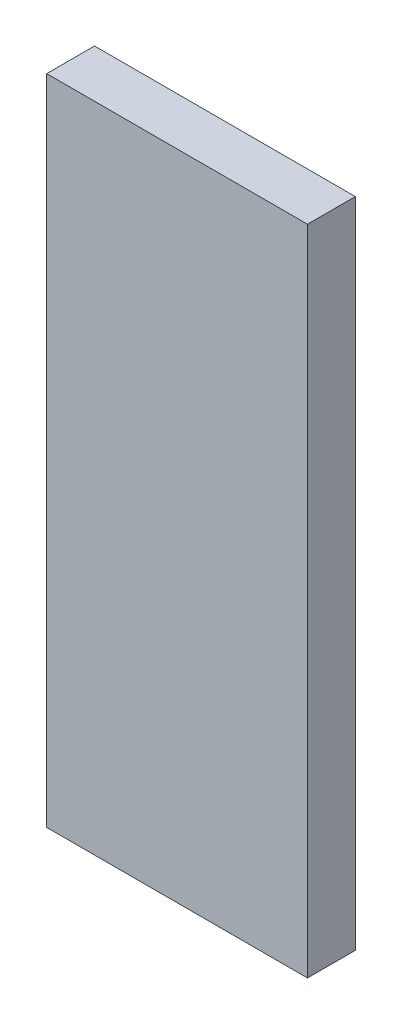
ISO-10303-21;
HEADER;
FILE_DESCRIPTION(('STEP AP214'),'2;1');
FILE_NAME('part.step','',(''),(''),'','','');
FILE_SCHEMA(('AUTOMOTIVE_DESIGN { 1 0 10303 214 1 1 1 1 }'));
ENDSEC;
DATA;
#1=APPLICATION_CONTEXT('core data for automotive mechanical design processes');
#2=APPLICATION_PROTOCOL_DEFINITION('international standard','automotive_design',2000,#1);
#3=PRODUCT_CONTEXT('',#1,'mechanical');
#4=PRODUCT('Part','Part','',(#3));
#5=PRODUCT_RELATED_PRODUCT_CATEGORY('part','',(#4));
#6=PRODUCT_DEFINITION_FORMATION('','',#4);
#7=PRODUCT_DEFINITION_CONTEXT('part definition',#1,'design');
#8=PRODUCT_DEFINITION('design','',#6,#7);
#9=PRODUCT_DEFINITION_SHAPE('','',#8);
#10=(LENGTH_UNIT() NAMED_UNIT(*) SI_UNIT(.MILLI.,.METRE.));
#11=(NAMED_UNIT(*) PLANE_ANGLE_UNIT() SI_UNIT($,.RADIAN.));
#12=(NAMED_UNIT(*) SI_UNIT($,.STERADIAN.) SOLID_ANGLE_UNIT());
#13=UNCERTAINTY_MEASURE_WITH_UNIT(LENGTH_MEASURE(1.E-05),#10,'distance_accuracy_value','');
#14=(GEOMETRIC_REPRESENTATION_CONTEXT(3) GLOBAL_UNCERTAINTY_ASSIGNED_CONTEXT((#13)) GLOBAL_UNIT_ASSIGNED_CONTEXT((#10,
#11,#12)) REPRESENTATION_CONTEXT('',''));
#15=CARTESIAN_POINT('',(0.,0.,0.));
#16=DIRECTION('',(0.,0.,1.));
#17=DIRECTION('',(1.,0.,0.));
#18=AXIS2_PLACEMENT_3D('',#15,#16,#17);
#19=CARTESIAN_POINT('',(0.,0.,5.08));
#20=DIRECTION('',(1.,0.,0.));
#21=DIRECTION('',(0.,0.,-1.));
#22=AXIS2_PLACEMENT_3D('',#19,#20,#21);
#23=PLANE('',#22);
#24=DIRECTION('',(0.,-1.,0.));
#25=VECTOR('',#24,1.);
#26=CARTESIAN_POINT('',(0.,0.,0.));
#27=LINE('',#26,#25);
#28=CARTESIAN_POINT('',(0.,69.3,0.));
#29=VERTEX_POINT('',#28);
#30=CARTESIAN_POINT('',(0.,0.,0.));
#31=VERTEX_POINT('',#30);
#32=EDGE_CURVE('E96',#29,#31,#27,.T.);
#33=ORIENTED_EDGE('',*,*,#32,.T.);
#34=DIRECTION('',(0.,0.,-1.));
#35=VECTOR('',#34,1.);
#36=CARTESIAN_POINT('',(0.,0.,5.08));
#37=LINE('',#36,#35);
#38=CARTESIAN_POINT('',(0.,0.,5.08));
#39=VERTEX_POINT('',#38);
#40=EDGE_CURVE('E11',#39,#31,#37,.T.);
#41=ORIENTED_EDGE('',*,*,#40,.F.);
#42=DIRECTION('',(0.,-1.,0.));
#43=VECTOR('',#42,1.);
#44=CARTESIAN_POINT('',(0.,0.,5.08));
#45=LINE('',#44,#43);
#46=CARTESIAN_POINT('',(0.,69.3,5.08));
#47=VERTEX_POINT('',#46);
#48=EDGE_CURVE('E84',#47,#39,#45,.T.);
#49=ORIENTED_EDGE('',*,*,#48,.F.);
#50=DIRECTION('',(0.,0.,-1.));
#51=VECTOR('',#50,1.);
#52=CARTESIAN_POINT('',(0.,69.3,5.08));
#53=LINE('',#52,#51);
#54=EDGE_CURVE('E92',#47,#29,#53,.T.);
#55=ORIENTED_EDGE('',*,*,#54,.T.);
#56=EDGE_LOOP('',(#33,#41,#49,#55));
#57=FACE_BOUND('',#56,.T.);
#58=ADVANCED_FACE('F33',(#57),#23,.F.);
#59=CARTESIAN_POINT('',(0.,0.,5.08));
#60=DIRECTION('',(0.,1.,0.));
#61=DIRECTION('',(0.,0.,1.));
#62=AXIS2_PLACEMENT_3D('',#59,#60,#61);
#63=PLANE('',#62);
#64=DIRECTION('',(1.,0.,0.));
#65=VECTOR('',#64,1.);
#66=CARTESIAN_POINT('',(0.,0.,0.));
#67=LINE('',#66,#65);
#68=CARTESIAN_POINT('',(27.686,0.,0.));
#69=VERTEX_POINT('',#68);
#70=EDGE_CURVE('E88',#31,#69,#67,.T.);
#71=ORIENTED_EDGE('',*,*,#70,.T.);
#72=DIRECTION('',(0.,0.,-1.));
#73=VECTOR('',#72,1.);
#74=CARTESIAN_POINT('',(27.686,0.,5.08));
#75=LINE('',#74,#73);
#76=CARTESIAN_POINT('',(27.686,0.,5.08));
#77=VERTEX_POINT('',#76);
#78=EDGE_CURVE('E41',#77,#69,#75,.T.);
#79=ORIENTED_EDGE('',*,*,#78,.F.);
#80=DIRECTION('',(1.,0.,0.));
#81=VECTOR('',#80,1.);
#82=CARTESIAN_POINT('',(0.,0.,5.08));
#83=LINE('',#82,#81);
#84=EDGE_CURVE('E79',#39,#77,#83,.T.);
#85=ORIENTED_EDGE('',*,*,#84,.F.);
#86=ORIENTED_EDGE('',*,*,#40,.T.);
#87=EDGE_LOOP('',(#71,#79,#85,#86));
#88=FACE_BOUND('',#87,.T.);
#89=ADVANCED_FACE('F87',(#88),#63,.F.);
#90=CARTESIAN_POINT('',(27.686,0.,5.08));
#91=DIRECTION('',(-1.,0.,0.));
#92=DIRECTION('',(0.,-1.,0.));
#93=AXIS2_PLACEMENT_3D('',#90,#91,#92);
#94=PLANE('',#93);
#95=DIRECTION('',(0.,1.,0.));
#96=VECTOR('',#95,1.);
#97=CARTESIAN_POINT('',(27.686,0.,0.));
#98=LINE('',#97,#96);
#99=CARTESIAN_POINT('',(27.686,69.3,0.));
#100=VERTEX_POINT('',#99);
#101=EDGE_CURVE('E66',#69,#100,#98,.T.);
#102=ORIENTED_EDGE('',*,*,#101,.T.);
#103=DIRECTION('',(0.,0.,-1.));
#104=VECTOR('',#103,1.);
#105=CARTESIAN_POINT('',(27.686,69.3,5.08));
#106=LINE('',#105,#104);
#107=CARTESIAN_POINT('',(27.686,69.3,5.08));
#108=VERTEX_POINT('',#107);
#109=EDGE_CURVE('E89',#108,#100,#106,.T.);
#110=ORIENTED_EDGE('',*,*,#109,.F.);
#111=DIRECTION('',(0.,1.,0.));
#112=VECTOR('',#111,1.);
#113=CARTESIAN_POINT('',(27.686,0.,5.08));
#114=LINE('',#113,#112);
#115=EDGE_CURVE('E82',#77,#108,#114,.T.);
#116=ORIENTED_EDGE('',*,*,#115,.F.);
#117=ORIENTED_EDGE('',*,*,#78,.T.);
#118=EDGE_LOOP('',(#102,#110,#116,#117));
#119=FACE_BOUND('',#118,.T.);
#120=ADVANCED_FACE('F90',(#119),#94,.F.);
#121=CARTESIAN_POINT('',(0.,69.3,5.08));
#122=DIRECTION('',(0.,-1.,0.));
#123=DIRECTION('',(1.,0.,0.));
#124=AXIS2_PLACEMENT_3D('',#121,#122,#123);
#125=PLANE('',#124);
#126=DIRECTION('',(-1.,0.,0.));
#127=VECTOR('',#126,1.);
#128=CARTESIAN_POINT('',(0.,69.3,0.));
#129=LINE('',#128,#127);
#130=EDGE_CURVE('E72',#100,#29,#129,.T.);
#131=ORIENTED_EDGE('',*,*,#130,.T.);
#132=ORIENTED_EDGE('',*,*,#54,.F.);
#133=DIRECTION('',(-1.,0.,0.));
#134=VECTOR('',#133,1.);
#135=CARTESIAN_POINT('',(0.,69.3,5.08));
#136=LINE('',#135,#134);
#137=EDGE_CURVE('E49',#108,#47,#136,.T.);
#138=ORIENTED_EDGE('',*,*,#137,.F.);
#139=ORIENTED_EDGE('',*,*,#109,.T.);
#140=EDGE_LOOP('',(#131,#132,#138,#139));
#141=FACE_BOUND('',#140,.T.);
#142=ADVANCED_FACE('F103',(#141),#125,.F.);
#143=CARTESIAN_POINT('',(0.,0.,5.08));
#144=DIRECTION('',(0.,0.,-1.));
#145=DIRECTION('',(-1.,0.,0.));
#146=AXIS2_PLACEMENT_3D('',#143,#144,#145);
#147=PLANE('',#146);
#148=ORIENTED_EDGE('',*,*,#48,.T.);
#149=ORIENTED_EDGE('',*,*,#84,.T.);
#150=ORIENTED_EDGE('',*,*,#115,.T.);
#151=ORIENTED_EDGE('',*,*,#137,.T.);
#152=EDGE_LOOP('',(#148,#149,#150,#151));
#153=FACE_BOUND('',#152,.T.);
#154=ADVANCED_FACE('F80',(#153),#147,.F.);
#155=CARTESIAN_POINT('',(0.,0.,0.));
#156=DIRECTION('',(0.,0.,-1.));
#157=DIRECTION('',(-1.,0.,0.));
#158=AXIS2_PLACEMENT_3D('',#155,#156,#157);
#159=PLANE('',#158);
#160=ORIENTED_EDGE('',*,*,#32,.F.);
#161=ORIENTED_EDGE('',*,*,#130,.F.);
#162=ORIENTED_EDGE('',*,*,#101,.F.);
#163=ORIENTED_EDGE('',*,*,#70,.F.);
#164=EDGE_LOOP('',(#160,#161,#162,#163));
#165=FACE_BOUND('',#164,.T.);
#166=ADVANCED_FACE('F106',(#165),#159,.T.);
#167=CLOSED_SHELL('',(#58,#89,#120,#142,#154,#166));
#168=MANIFOLD_SOLID_BREP('B2',#167);
#169=ADVANCED_BREP_SHAPE_REPRESENTATION('',(#18,#168),#14);
#170=SHAPE_DEFINITION_REPRESENTATION(#9,#169);
ENDSEC;
END-ISO-10303-21;
